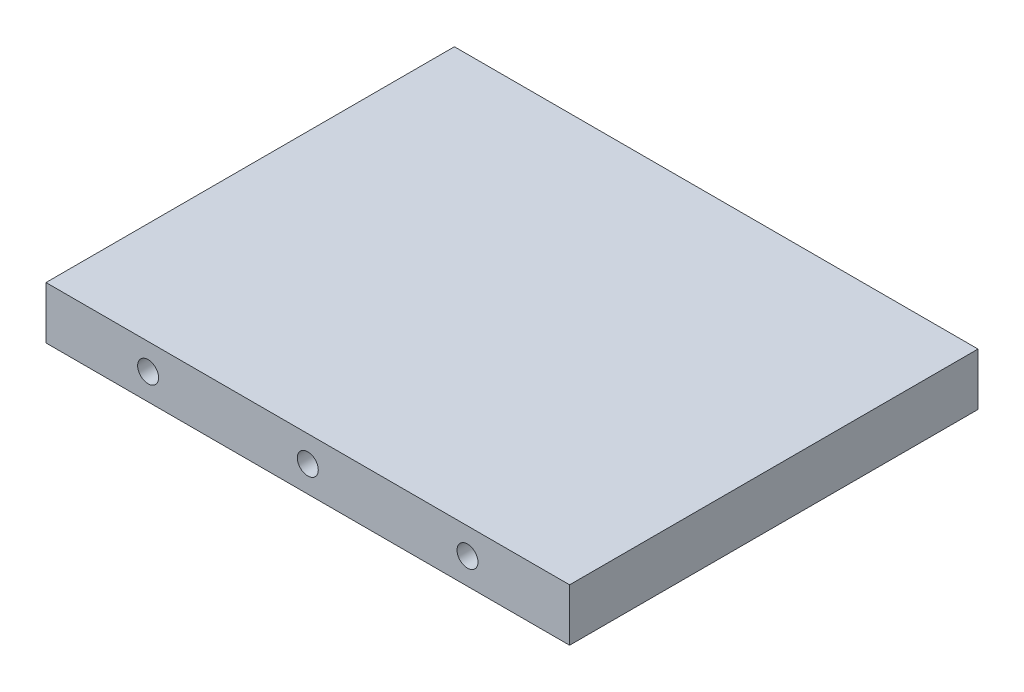
ISO-10303-21;
HEADER;
FILE_DESCRIPTION(('STEP AP214'),'2;1');
FILE_NAME('part.step','',(''),(''),'','','');
FILE_SCHEMA(('AUTOMOTIVE_DESIGN { 1 0 10303 214 1 1 1 1 }'));
ENDSEC;
DATA;
#1=APPLICATION_CONTEXT('core data for automotive mechanical design processes');
#2=APPLICATION_PROTOCOL_DEFINITION('international standard','automotive_design',2000,#1);
#3=PRODUCT_CONTEXT('',#1,'mechanical');
#4=PRODUCT('Part','Part','',(#3));
#5=PRODUCT_RELATED_PRODUCT_CATEGORY('part','',(#4));
#6=PRODUCT_DEFINITION_FORMATION('','',#4);
#7=PRODUCT_DEFINITION_CONTEXT('part definition',#1,'design');
#8=PRODUCT_DEFINITION('design','',#6,#7);
#9=PRODUCT_DEFINITION_SHAPE('','',#8);
#10=(LENGTH_UNIT() NAMED_UNIT(*) SI_UNIT(.MILLI.,.METRE.));
#11=(NAMED_UNIT(*) PLANE_ANGLE_UNIT() SI_UNIT($,.RADIAN.));
#12=(NAMED_UNIT(*) SI_UNIT($,.STERADIAN.) SOLID_ANGLE_UNIT());
#13=UNCERTAINTY_MEASURE_WITH_UNIT(LENGTH_MEASURE(1.E-05),#10,'distance_accuracy_value','');
#14=(GEOMETRIC_REPRESENTATION_CONTEXT(3) GLOBAL_UNCERTAINTY_ASSIGNED_CONTEXT((#13)) GLOBAL_UNIT_ASSIGNED_CONTEXT((#10,
#11,#12)) REPRESENTATION_CONTEXT('',''));
#15=CARTESIAN_POINT('',(0.,0.,0.));
#16=DIRECTION('',(0.,0.,1.));
#17=DIRECTION('',(1.,0.,0.));
#18=AXIS2_PLACEMENT_3D('',#15,#16,#17);
#19=CARTESIAN_POINT('',(0.,0.,-78.));
#20=DIRECTION('',(-1.,0.,0.));
#21=DIRECTION('',(0.,0.,1.));
#22=AXIS2_PLACEMENT_3D('',#19,#20,#21);
#23=PLANE('',#22);
#24=DIRECTION('',(0.,-1.,0.));
#25=VECTOR('',#24,1.);
#26=CARTESIAN_POINT('',(0.,0.,0.));
#27=LINE('',#26,#25);
#28=CARTESIAN_POINT('',(0.,10.,0.));
#29=VERTEX_POINT('',#28);
#30=CARTESIAN_POINT('',(0.,0.,0.));
#31=VERTEX_POINT('',#30);
#32=EDGE_CURVE('E97',#29,#31,#27,.T.);
#33=ORIENTED_EDGE('',*,*,#32,.F.);
#34=DIRECTION('',(0.,0.,1.));
#35=VECTOR('',#34,1.);
#36=CARTESIAN_POINT('',(0.,10.,-78.));
#37=LINE('',#36,#35);
#38=CARTESIAN_POINT('',(0.,10.,-78.));
#39=VERTEX_POINT('',#38);
#40=EDGE_CURVE('E11',#39,#29,#37,.T.);
#41=ORIENTED_EDGE('',*,*,#40,.F.);
#42=DIRECTION('',(0.,-1.,0.));
#43=VECTOR('',#42,1.);
#44=CARTESIAN_POINT('',(0.,0.,-78.));
#45=LINE('',#44,#43);
#46=CARTESIAN_POINT('',(0.,0.,-78.));
#47=VERTEX_POINT('',#46);
#48=EDGE_CURVE('E90',#39,#47,#45,.T.);
#49=ORIENTED_EDGE('',*,*,#48,.T.);
#50=DIRECTION('',(0.,0.,1.));
#51=VECTOR('',#50,1.);
#52=CARTESIAN_POINT('',(0.,0.,-78.));
#53=LINE('',#52,#51);
#54=EDGE_CURVE('E35',#47,#31,#53,.T.);
#55=ORIENTED_EDGE('',*,*,#54,.T.);
#56=EDGE_LOOP('',(#33,#41,#49,#55));
#57=FACE_BOUND('',#56,.T.);
#58=ADVANCED_FACE('F32',(#57),#23,.T.);
#59=CARTESIAN_POINT('',(0.,10.,-78.));
#60=DIRECTION('',(0.,1.,0.));
#61=DIRECTION('',(0.,0.,1.));
#62=AXIS2_PLACEMENT_3D('',#59,#60,#61);
#63=PLANE('',#62);
#64=DIRECTION('',(-1.,0.,0.));
#65=VECTOR('',#64,1.);
#66=CARTESIAN_POINT('',(0.,10.,0.));
#67=LINE('',#66,#65);
#68=CARTESIAN_POINT('',(100.,10.,0.));
#69=VERTEX_POINT('',#68);
#70=EDGE_CURVE('E92',#69,#29,#67,.T.);
#71=ORIENTED_EDGE('',*,*,#70,.F.);
#72=DIRECTION('',(0.,0.,1.));
#73=VECTOR('',#72,1.);
#74=CARTESIAN_POINT('',(100.,10.,-78.));
#75=LINE('',#74,#73);
#76=CARTESIAN_POINT('',(100.,10.,-78.));
#77=VERTEX_POINT('',#76);
#78=EDGE_CURVE('E41',#77,#69,#75,.T.);
#79=ORIENTED_EDGE('',*,*,#78,.F.);
#80=DIRECTION('',(-1.,0.,0.));
#81=VECTOR('',#80,1.);
#82=CARTESIAN_POINT('',(0.,10.,-78.));
#83=LINE('',#82,#81);
#84=EDGE_CURVE('E87',#77,#39,#83,.T.);
#85=ORIENTED_EDGE('',*,*,#84,.T.);
#86=ORIENTED_EDGE('',*,*,#40,.T.);
#87=EDGE_LOOP('',(#71,#79,#85,#86));
#88=FACE_BOUND('',#87,.T.);
#89=ADVANCED_FACE('F108',(#88),#63,.T.);
#90=CARTESIAN_POINT('',(100.,0.,-78.));
#91=DIRECTION('',(1.,0.,0.));
#92=DIRECTION('',(0.,0.,-1.));
#93=AXIS2_PLACEMENT_3D('',#90,#91,#92);
#94=PLANE('',#93);
#95=DIRECTION('',(0.,1.,0.));
#96=VECTOR('',#95,1.);
#97=CARTESIAN_POINT('',(100.,0.,0.));
#98=LINE('',#97,#96);
#99=CARTESIAN_POINT('',(100.,0.,0.));
#100=VERTEX_POINT('',#99);
#101=EDGE_CURVE('E82',#100,#69,#98,.T.);
#102=ORIENTED_EDGE('',*,*,#101,.F.);
#103=DIRECTION('',(0.,0.,1.));
#104=VECTOR('',#103,1.);
#105=CARTESIAN_POINT('',(100.,0.,-78.));
#106=LINE('',#105,#104);
#107=CARTESIAN_POINT('',(100.,0.,-78.));
#108=VERTEX_POINT('',#107);
#109=EDGE_CURVE('E77',#108,#100,#106,.T.);
#110=ORIENTED_EDGE('',*,*,#109,.F.);
#111=DIRECTION('',(0.,1.,0.));
#112=VECTOR('',#111,1.);
#113=CARTESIAN_POINT('',(100.,0.,-78.));
#114=LINE('',#113,#112);
#115=EDGE_CURVE('E80',#108,#77,#114,.T.);
#116=ORIENTED_EDGE('',*,*,#115,.T.);
#117=ORIENTED_EDGE('',*,*,#78,.T.);
#118=EDGE_LOOP('',(#102,#110,#116,#117));
#119=FACE_BOUND('',#118,.T.);
#120=ADVANCED_FACE('F79',(#119),#94,.T.);
#121=CARTESIAN_POINT('',(0.,0.,-78.));
#122=DIRECTION('',(0.,-1.,0.));
#123=DIRECTION('',(0.,0.,-1.));
#124=AXIS2_PLACEMENT_3D('',#121,#122,#123);
#125=PLANE('',#124);
#126=DIRECTION('',(1.,0.,0.));
#127=VECTOR('',#126,1.);
#128=CARTESIAN_POINT('',(0.,0.,0.));
#129=LINE('',#128,#127);
#130=EDGE_CURVE('E100',#31,#100,#129,.T.);
#131=ORIENTED_EDGE('',*,*,#130,.F.);
#132=ORIENTED_EDGE('',*,*,#54,.F.);
#133=DIRECTION('',(1.,0.,0.));
#134=VECTOR('',#133,1.);
#135=CARTESIAN_POINT('',(0.,0.,-78.));
#136=LINE('',#135,#134);
#137=EDGE_CURVE('E86',#47,#108,#136,.T.);
#138=ORIENTED_EDGE('',*,*,#137,.T.);
#139=ORIENTED_EDGE('',*,*,#109,.T.);
#140=EDGE_LOOP('',(#131,#132,#138,#139));
#141=FACE_BOUND('',#140,.T.);
#142=ADVANCED_FACE('F89',(#141),#125,.T.);
#143=CARTESIAN_POINT('',(0.,0.,-78.));
#144=DIRECTION('',(0.,0.,-1.));
#145=DIRECTION('',(-1.,0.,0.));
#146=AXIS2_PLACEMENT_3D('',#143,#144,#145);
#147=PLANE('',#146);
#148=CARTESIAN_POINT('',(19.5,5.00000000000001,-78.));
#149=DIRECTION('',(0.,0.,-1.));
#150=DIRECTION('',(1.,0.,0.));
#151=AXIS2_PLACEMENT_3D('',#148,#149,#150);
#152=CIRCLE('',#151,2.);
#153=CARTESIAN_POINT('',(21.5,5.00000000000001,-78.));
#154=VERTEX_POINT('',#153);
#155=EDGE_CURVE('E183',#154,#154,#152,.T.);
#156=ORIENTED_EDGE('',*,*,#155,.F.);
#157=EDGE_LOOP('',(#156));
#158=FACE_BOUND('',#157,.T.);
#159=CARTESIAN_POINT('',(50.,5.,-78.));
#160=DIRECTION('',(0.,0.,-1.));
#161=DIRECTION('',(-1.,0.,0.));
#162=AXIS2_PLACEMENT_3D('',#159,#160,#161);
#163=CIRCLE('',#162,2.);
#164=CARTESIAN_POINT('',(48.,5.,-78.));
#165=VERTEX_POINT('',#164);
#166=EDGE_CURVE('E182',#165,#165,#163,.T.);
#167=ORIENTED_EDGE('',*,*,#166,.F.);
#168=EDGE_LOOP('',(#167));
#169=FACE_BOUND('',#168,.T.);
#170=CARTESIAN_POINT('',(80.5,5.,-78.));
#171=DIRECTION('',(0.,0.,-1.));
#172=DIRECTION('',(-1.,0.,0.));
#173=AXIS2_PLACEMENT_3D('',#170,#171,#172);
#174=CIRCLE('',#173,2.);
#175=CARTESIAN_POINT('',(78.5,5.,-78.));
#176=VERTEX_POINT('',#175);
#177=EDGE_CURVE('E192',#176,#176,#174,.T.);
#178=ORIENTED_EDGE('',*,*,#177,.F.);
#179=EDGE_LOOP('',(#178));
#180=FACE_BOUND('',#179,.T.);
#181=ORIENTED_EDGE('',*,*,#48,.F.);
#182=ORIENTED_EDGE('',*,*,#84,.F.);
#183=ORIENTED_EDGE('',*,*,#115,.F.);
#184=ORIENTED_EDGE('',*,*,#137,.F.);
#185=EDGE_LOOP('',(#181,#182,#183,#184));
#186=FACE_BOUND('',#185,.T.);
#187=ADVANCED_FACE('F85',(#158,#169,#180,#186),#147,.T.);
#188=CARTESIAN_POINT('',(0.,0.,0.));
#189=DIRECTION('',(0.,0.,-1.));
#190=DIRECTION('',(-1.,0.,0.));
#191=AXIS2_PLACEMENT_3D('',#188,#189,#190);
#192=PLANE('',#191);
#193=CARTESIAN_POINT('',(80.5,5.00000000000001,0.));
#194=DIRECTION('',(0.,0.,1.));
#195=DIRECTION('',(-1.,0.,0.));
#196=AXIS2_PLACEMENT_3D('',#193,#194,#195);
#197=CIRCLE('',#196,2.00000000000001);
#198=CARTESIAN_POINT('',(78.5,5.00000000000001,0.));
#199=VERTEX_POINT('',#198);
#200=EDGE_CURVE('E197',#199,#199,#197,.T.);
#201=ORIENTED_EDGE('',*,*,#200,.F.);
#202=EDGE_LOOP('',(#201));
#203=FACE_BOUND('',#202,.T.);
#204=CARTESIAN_POINT('',(50.,5.,0.));
#205=DIRECTION('',(0.,0.,1.));
#206=DIRECTION('',(1.,0.,0.));
#207=AXIS2_PLACEMENT_3D('',#204,#205,#206);
#208=CIRCLE('',#207,2.);
#209=CARTESIAN_POINT('',(52.,5.,0.));
#210=VERTEX_POINT('',#209);
#211=EDGE_CURVE('E203',#210,#210,#208,.T.);
#212=ORIENTED_EDGE('',*,*,#211,.F.);
#213=EDGE_LOOP('',(#212));
#214=FACE_BOUND('',#213,.T.);
#215=CARTESIAN_POINT('',(19.5,5.,0.));
#216=DIRECTION('',(0.,0.,1.));
#217=DIRECTION('',(1.,0.,0.));
#218=AXIS2_PLACEMENT_3D('',#215,#216,#217);
#219=CIRCLE('',#218,2.);
#220=CARTESIAN_POINT('',(21.5,5.,0.));
#221=VERTEX_POINT('',#220);
#222=EDGE_CURVE('E209',#221,#221,#219,.T.);
#223=ORIENTED_EDGE('',*,*,#222,.F.);
#224=EDGE_LOOP('',(#223));
#225=FACE_BOUND('',#224,.T.);
#226=ORIENTED_EDGE('',*,*,#32,.T.);
#227=ORIENTED_EDGE('',*,*,#130,.T.);
#228=ORIENTED_EDGE('',*,*,#101,.T.);
#229=ORIENTED_EDGE('',*,*,#70,.T.);
#230=EDGE_LOOP('',(#226,#227,#228,#229));
#231=FACE_BOUND('',#230,.T.);
#232=ADVANCED_FACE('F107',(#203,#214,#225,#231),#192,.F.);
#233=CARTESIAN_POINT('',(19.5,5.,-15.));
#234=DIRECTION('',(0.,0.,1.));
#235=DIRECTION('',(1.,0.,0.));
#236=AXIS2_PLACEMENT_3D('',#233,#234,#235);
#237=CYLINDRICAL_SURFACE('',#236,2.);
#238=CARTESIAN_POINT('',(19.5,5.,-15.));
#239=DIRECTION('',(0.,0.,1.));
#240=DIRECTION('',(1.,0.,0.));
#241=AXIS2_PLACEMENT_3D('',#238,#239,#240);
#242=CIRCLE('',#241,2.);
#243=CARTESIAN_POINT('',(21.5,5.,-15.));
#244=VERTEX_POINT('',#243);
#245=EDGE_CURVE('E101',#244,#244,#242,.T.);
#246=ORIENTED_EDGE('',*,*,#245,.F.);
#247=EDGE_LOOP('',(#246));
#248=FACE_BOUND('',#247,.T.);
#249=ORIENTED_EDGE('',*,*,#222,.T.);
#250=EDGE_LOOP('',(#249));
#251=FACE_BOUND('',#250,.T.);
#252=ADVANCED_FACE('F126',(#248,#251),#237,.F.);
#253=CARTESIAN_POINT('',(19.5,5.,-15.));
#254=DIRECTION('',(0.,0.,1.));
#255=DIRECTION('',(1.,0.,0.));
#256=AXIS2_PLACEMENT_3D('',#253,#254,#255);
#257=PLANE('',#256);
#258=ORIENTED_EDGE('',*,*,#245,.T.);
#259=EDGE_LOOP('',(#258));
#260=FACE_BOUND('',#259,.T.);
#261=ADVANCED_FACE('F133',(#260),#257,.T.);
#262=CARTESIAN_POINT('',(50.,5.,-15.));
#263=DIRECTION('',(0.,0.,1.));
#264=DIRECTION('',(1.,0.,0.));
#265=AXIS2_PLACEMENT_3D('',#262,#263,#264);
#266=CYLINDRICAL_SURFACE('',#265,2.);
#267=CARTESIAN_POINT('',(50.,5.,-15.));
#268=DIRECTION('',(0.,0.,1.));
#269=DIRECTION('',(1.,0.,0.));
#270=AXIS2_PLACEMENT_3D('',#267,#268,#269);
#271=CIRCLE('',#270,2.);
#272=CARTESIAN_POINT('',(52.,5.,-15.));
#273=VERTEX_POINT('',#272);
#274=EDGE_CURVE('E206',#273,#273,#271,.T.);
#275=ORIENTED_EDGE('',*,*,#274,.F.);
#276=EDGE_LOOP('',(#275));
#277=FACE_BOUND('',#276,.T.);
#278=ORIENTED_EDGE('',*,*,#211,.T.);
#279=EDGE_LOOP('',(#278));
#280=FACE_BOUND('',#279,.T.);
#281=ADVANCED_FACE('F137',(#277,#280),#266,.F.);
#282=CARTESIAN_POINT('',(50.,5.,-15.));
#283=DIRECTION('',(0.,0.,1.));
#284=DIRECTION('',(1.,0.,0.));
#285=AXIS2_PLACEMENT_3D('',#282,#283,#284);
#286=PLANE('',#285);
#287=ORIENTED_EDGE('',*,*,#274,.T.);
#288=EDGE_LOOP('',(#287));
#289=FACE_BOUND('',#288,.T.);
#290=ADVANCED_FACE('F141',(#289),#286,.T.);
#291=CARTESIAN_POINT('',(80.5,5.00000000000001,-15.));
#292=DIRECTION('',(0.,0.,1.));
#293=DIRECTION('',(1.,0.,0.));
#294=AXIS2_PLACEMENT_3D('',#291,#292,#293);
#295=CYLINDRICAL_SURFACE('',#294,2.00000000000001);
#296=CARTESIAN_POINT('',(80.5,5.00000000000001,-15.));
#297=DIRECTION('',(0.,0.,1.));
#298=DIRECTION('',(-1.,0.,0.));
#299=AXIS2_PLACEMENT_3D('',#296,#297,#298);
#300=CIRCLE('',#299,2.00000000000001);
#301=CARTESIAN_POINT('',(78.5,5.00000000000001,-15.));
#302=VERTEX_POINT('',#301);
#303=EDGE_CURVE('E200',#302,#302,#300,.T.);
#304=ORIENTED_EDGE('',*,*,#303,.F.);
#305=EDGE_LOOP('',(#304));
#306=FACE_BOUND('',#305,.T.);
#307=ORIENTED_EDGE('',*,*,#200,.T.);
#308=EDGE_LOOP('',(#307));
#309=FACE_BOUND('',#308,.T.);
#310=ADVANCED_FACE('F145',(#306,#309),#295,.F.);
#311=CARTESIAN_POINT('',(80.5,5.00000000000001,-15.));
#312=DIRECTION('',(0.,0.,-1.));
#313=DIRECTION('',(-1.,0.,0.));
#314=AXIS2_PLACEMENT_3D('',#311,#312,#313);
#315=PLANE('',#314);
#316=ORIENTED_EDGE('',*,*,#303,.T.);
#317=EDGE_LOOP('',(#316));
#318=FACE_BOUND('',#317,.T.);
#319=ADVANCED_FACE('F149',(#318),#315,.F.);
#320=CARTESIAN_POINT('',(80.5,5.,-63.));
#321=DIRECTION('',(0.,0.,-1.));
#322=DIRECTION('',(-1.,0.,0.));
#323=AXIS2_PLACEMENT_3D('',#320,#321,#322);
#324=CYLINDRICAL_SURFACE('',#323,2.);
#325=CARTESIAN_POINT('',(80.5,5.,-63.));
#326=DIRECTION('',(0.,0.,-1.));
#327=DIRECTION('',(-1.,0.,0.));
#328=AXIS2_PLACEMENT_3D('',#325,#326,#327);
#329=CIRCLE('',#328,2.);
#330=CARTESIAN_POINT('',(78.5,5.,-63.));
#331=VERTEX_POINT('',#330);
#332=EDGE_CURVE('E194',#331,#331,#329,.T.);
#333=ORIENTED_EDGE('',*,*,#332,.F.);
#334=EDGE_LOOP('',(#333));
#335=FACE_BOUND('',#334,.T.);
#336=ORIENTED_EDGE('',*,*,#177,.T.);
#337=EDGE_LOOP('',(#336));
#338=FACE_BOUND('',#337,.T.);
#339=ADVANCED_FACE('F153',(#335,#338),#324,.F.);
#340=CARTESIAN_POINT('',(80.5,5.,-63.));
#341=DIRECTION('',(0.,0.,-1.));
#342=DIRECTION('',(-1.,0.,0.));
#343=AXIS2_PLACEMENT_3D('',#340,#341,#342);
#344=PLANE('',#343);
#345=ORIENTED_EDGE('',*,*,#332,.T.);
#346=EDGE_LOOP('',(#345));
#347=FACE_BOUND('',#346,.T.);
#348=ADVANCED_FACE('F157',(#347),#344,.T.);
#349=CARTESIAN_POINT('',(50.,5.,-63.));
#350=DIRECTION('',(0.,0.,-1.));
#351=DIRECTION('',(-1.,0.,0.));
#352=AXIS2_PLACEMENT_3D('',#349,#350,#351);
#353=CYLINDRICAL_SURFACE('',#352,2.);
#354=CARTESIAN_POINT('',(50.,5.,-63.));
#355=DIRECTION('',(0.,0.,-1.));
#356=DIRECTION('',(-1.,0.,0.));
#357=AXIS2_PLACEMENT_3D('',#354,#355,#356);
#358=CIRCLE('',#357,2.);
#359=CARTESIAN_POINT('',(48.,5.,-63.));
#360=VERTEX_POINT('',#359);
#361=EDGE_CURVE('E186',#360,#360,#358,.T.);
#362=ORIENTED_EDGE('',*,*,#361,.F.);
#363=EDGE_LOOP('',(#362));
#364=FACE_BOUND('',#363,.T.);
#365=ORIENTED_EDGE('',*,*,#166,.T.);
#366=EDGE_LOOP('',(#365));
#367=FACE_BOUND('',#366,.T.);
#368=ADVANCED_FACE('F161',(#364,#367),#353,.F.);
#369=CARTESIAN_POINT('',(50.,5.,-63.));
#370=DIRECTION('',(0.,0.,-1.));
#371=DIRECTION('',(-1.,0.,0.));
#372=AXIS2_PLACEMENT_3D('',#369,#370,#371);
#373=PLANE('',#372);
#374=ORIENTED_EDGE('',*,*,#361,.T.);
#375=EDGE_LOOP('',(#374));
#376=FACE_BOUND('',#375,.T.);
#377=ADVANCED_FACE('F165',(#376),#373,.T.);
#378=CARTESIAN_POINT('',(19.5,5.00000000000001,-63.));
#379=DIRECTION('',(0.,0.,-1.));
#380=DIRECTION('',(-1.,0.,0.));
#381=AXIS2_PLACEMENT_3D('',#378,#379,#380);
#382=CYLINDRICAL_SURFACE('',#381,2.);
#383=CARTESIAN_POINT('',(19.5,5.00000000000001,-63.));
#384=DIRECTION('',(0.,0.,-1.));
#385=DIRECTION('',(1.,0.,0.));
#386=AXIS2_PLACEMENT_3D('',#383,#384,#385);
#387=CIRCLE('',#386,2.);
#388=CARTESIAN_POINT('',(21.5,5.00000000000001,-63.));
#389=VERTEX_POINT('',#388);
#390=EDGE_CURVE('E181',#389,#389,#387,.T.);
#391=ORIENTED_EDGE('',*,*,#390,.F.);
#392=EDGE_LOOP('',(#391));
#393=FACE_BOUND('',#392,.T.);
#394=ORIENTED_EDGE('',*,*,#155,.T.);
#395=EDGE_LOOP('',(#394));
#396=FACE_BOUND('',#395,.T.);
#397=ADVANCED_FACE('F169',(#393,#396),#382,.F.);
#398=CARTESIAN_POINT('',(19.5,5.00000000000001,-63.));
#399=DIRECTION('',(0.,0.,1.));
#400=DIRECTION('',(1.,0.,0.));
#401=AXIS2_PLACEMENT_3D('',#398,#399,#400);
#402=PLANE('',#401);
#403=ORIENTED_EDGE('',*,*,#390,.T.);
#404=EDGE_LOOP('',(#403));
#405=FACE_BOUND('',#404,.T.);
#406=ADVANCED_FACE('F173',(#405),#402,.F.);
#407=CLOSED_SHELL('',(#58,#89,#120,#142,#187,#232,#252,#261,#281,#290,#310,#319,#339,#348,#368,
#377,#397,#406));
#408=MANIFOLD_SOLID_BREP('B2',#407);
#409=ADVANCED_BREP_SHAPE_REPRESENTATION('',(#18,#408),#14);
#410=SHAPE_DEFINITION_REPRESENTATION(#9,#409);
ENDSEC;
END-ISO-10303-21;
